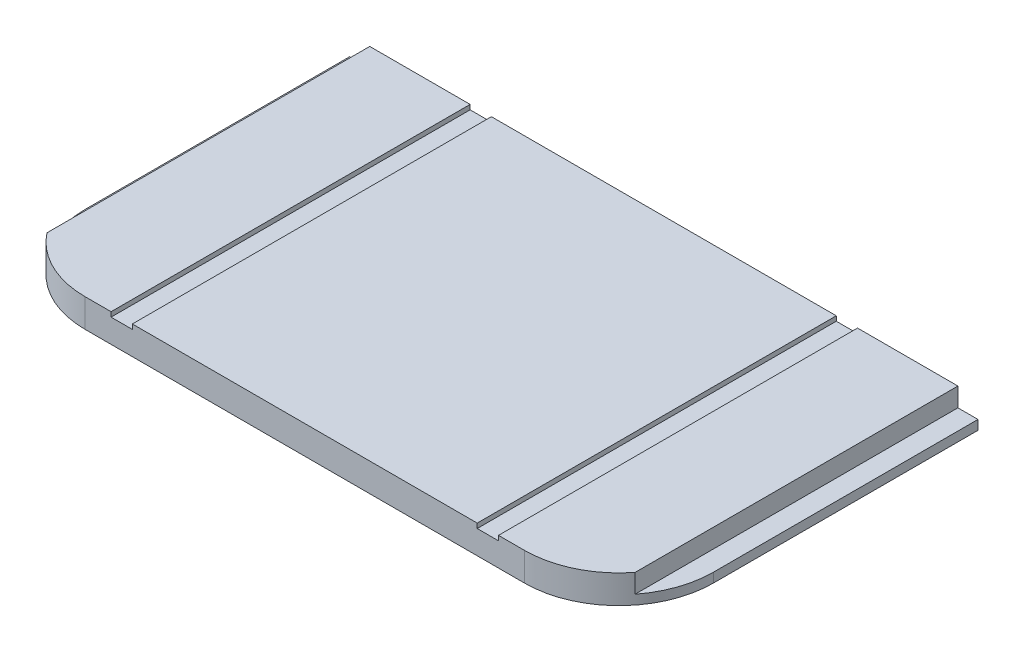
ISO-10303-21;
HEADER;
FILE_DESCRIPTION(('STEP AP214'),'2;1');
FILE_NAME('part.step','',(''),(''),'','','');
FILE_SCHEMA(('AUTOMOTIVE_DESIGN { 1 0 10303 214 1 1 1 1 }'));
ENDSEC;
DATA;
#1=APPLICATION_CONTEXT('core data for automotive mechanical design processes');
#2=APPLICATION_PROTOCOL_DEFINITION('international standard','automotive_design',2000,#1);
#3=PRODUCT_CONTEXT('',#1,'mechanical');
#4=PRODUCT('Part','Part','',(#3));
#5=PRODUCT_RELATED_PRODUCT_CATEGORY('part','',(#4));
#6=PRODUCT_DEFINITION_FORMATION('','',#4);
#7=PRODUCT_DEFINITION_CONTEXT('part definition',#1,'design');
#8=PRODUCT_DEFINITION('design','',#6,#7);
#9=PRODUCT_DEFINITION_SHAPE('','',#8);
#10=(LENGTH_UNIT() NAMED_UNIT(*) SI_UNIT(.MILLI.,.METRE.));
#11=(NAMED_UNIT(*) PLANE_ANGLE_UNIT() SI_UNIT($,.RADIAN.));
#12=(NAMED_UNIT(*) SI_UNIT($,.STERADIAN.) SOLID_ANGLE_UNIT());
#13=UNCERTAINTY_MEASURE_WITH_UNIT(LENGTH_MEASURE(1.E-05),#10,'distance_accuracy_value','');
#14=(GEOMETRIC_REPRESENTATION_CONTEXT(3) GLOBAL_UNCERTAINTY_ASSIGNED_CONTEXT((#13)) GLOBAL_UNIT_ASSIGNED_CONTEXT((#10,
#11,#12)) REPRESENTATION_CONTEXT('',''));
#15=CARTESIAN_POINT('',(0.,0.,0.));
#16=DIRECTION('',(0.,0.,1.));
#17=DIRECTION('',(1.,0.,0.));
#18=AXIS2_PLACEMENT_3D('',#15,#16,#17);
#19=CARTESIAN_POINT('',(211.1375,19.05,-120.65));
#20=DIRECTION('',(0.,-1.,0.));
#21=DIRECTION('',(0.,0.,-1.));
#22=AXIS2_PLACEMENT_3D('',#19,#20,#21);
#23=PLANE('',#22);
#24=DIRECTION('',(1.,0.,0.));
#25=VECTOR('',#24,1.);
#26=CARTESIAN_POINT('',(-211.1375,19.05,120.65));
#27=LINE('',#26,#25);
#28=CARTESIAN_POINT('',(-115.8875,19.05,120.65));
#29=VERTEX_POINT('',#28);
#30=CARTESIAN_POINT('',(115.8875,19.05,120.65));
#31=VERTEX_POINT('',#30);
#32=EDGE_CURVE('E258',#29,#31,#27,.T.);
#33=ORIENTED_EDGE('',*,*,#32,.T.);
#34=DIRECTION('',(0.,0.,1.));
#35=VECTOR('',#34,1.);
#36=CARTESIAN_POINT('',(115.8875,19.05,-120.651));
#37=LINE('',#36,#35);
#38=CARTESIAN_POINT('',(115.8875,19.05,-120.65));
#39=VERTEX_POINT('',#38);
#40=EDGE_CURVE('E209',#39,#31,#37,.T.);
#41=ORIENTED_EDGE('',*,*,#40,.F.);
#42=DIRECTION('',(-1.,0.,0.));
#43=VECTOR('',#42,1.);
#44=CARTESIAN_POINT('',(-211.1375,19.05,-120.65));
#45=LINE('',#44,#43);
#46=CARTESIAN_POINT('',(-115.8875,19.05,-120.65));
#47=VERTEX_POINT('',#46);
#48=EDGE_CURVE('E253',#39,#47,#45,.T.);
#49=ORIENTED_EDGE('',*,*,#48,.T.);
#50=DIRECTION('',(0.,0.,1.));
#51=VECTOR('',#50,1.);
#52=CARTESIAN_POINT('',(-115.8875,19.05,-120.651));
#53=LINE('',#52,#51);
#54=EDGE_CURVE('E238',#47,#29,#53,.T.);
#55=ORIENTED_EDGE('',*,*,#54,.T.);
#56=EDGE_LOOP('',(#33,#41,#49,#55));
#57=FACE_BOUND('',#56,.T.);
#58=ADVANCED_FACE('F33',(#57),#23,.F.);
#59=DIRECTION('',(0.,0.,1.));
#60=VECTOR('',#59,1.);
#61=CARTESIAN_POINT('',(-197.64375,19.05,-120.651));
#62=LINE('',#61,#60);
#63=CARTESIAN_POINT('',(-197.64375,19.05,-120.65));
#64=VERTEX_POINT('',#63);
#65=CARTESIAN_POINT('',(-197.64375,19.05,96.2859803880969));
#66=VERTEX_POINT('',#65);
#67=EDGE_CURVE('E247',#64,#66,#62,.T.);
#68=ORIENTED_EDGE('',*,*,#67,.T.);
#69=CARTESIAN_POINT('',(-147.6375,19.05,57.15));
#70=DIRECTION('',(0.,-1.,0.));
#71=DIRECTION('',(0.,0.,-1.));
#72=AXIS2_PLACEMENT_3D('',#69,#70,#71);
#73=CIRCLE('',#72,63.5);
#74=CARTESIAN_POINT('',(-147.6375,19.05,120.65));
#75=VERTEX_POINT('',#74);
#76=EDGE_CURVE('E11',#66,#75,#73,.F.);
#77=ORIENTED_EDGE('',*,*,#76,.T.);
#78=CARTESIAN_POINT('',(-130.175,19.05,120.65));
#79=VERTEX_POINT('',#78);
#80=EDGE_CURVE('E255',#75,#79,#27,.T.);
#81=ORIENTED_EDGE('',*,*,#80,.T.);
#82=DIRECTION('',(0.,0.,1.));
#83=VECTOR('',#82,1.);
#84=CARTESIAN_POINT('',(-130.175,19.05,-120.651));
#85=LINE('',#84,#83);
#86=CARTESIAN_POINT('',(-130.175,19.05,-120.65));
#87=VERTEX_POINT('',#86);
#88=EDGE_CURVE('E234',#87,#79,#85,.T.);
#89=ORIENTED_EDGE('',*,*,#88,.F.);
#90=EDGE_CURVE('E254',#87,#64,#45,.T.);
#91=ORIENTED_EDGE('',*,*,#90,.T.);
#92=EDGE_LOOP('',(#68,#77,#81,#89,#91));
#93=FACE_BOUND('',#92,.T.);
#94=ADVANCED_FACE('F335',(#93),#23,.F.);
#95=CARTESIAN_POINT('',(211.1375,19.05,120.65));
#96=DIRECTION('',(-1.,0.,0.));
#97=DIRECTION('',(0.,0.,1.));
#98=AXIS2_PLACEMENT_3D('',#95,#96,#97);
#99=PLANE('',#98);
#100=DIRECTION('',(0.,-1.,0.));
#101=VECTOR('',#100,1.);
#102=CARTESIAN_POINT('',(211.1375,19.05,-120.65));
#103=LINE('',#102,#101);
#104=CARTESIAN_POINT('',(211.1375,6.35,-120.65));
#105=VERTEX_POINT('',#104);
#106=CARTESIAN_POINT('',(211.1375,0.,-120.65));
#107=VERTEX_POINT('',#106);
#108=EDGE_CURVE('E271',#105,#107,#103,.T.);
#109=ORIENTED_EDGE('',*,*,#108,.F.);
#110=DIRECTION('',(0.,0.,-1.));
#111=VECTOR('',#110,1.);
#112=CARTESIAN_POINT('',(211.1375,6.35,120.651));
#113=LINE('',#112,#111);
#114=CARTESIAN_POINT('',(211.1375,6.35,57.15));
#115=VERTEX_POINT('',#114);
#116=EDGE_CURVE('E187',#115,#105,#113,.T.);
#117=ORIENTED_EDGE('',*,*,#116,.F.);
#118=DIRECTION('',(0.,-1.,0.));
#119=VECTOR('',#118,1.);
#120=CARTESIAN_POINT('',(211.1375,19.05,57.15));
#121=LINE('',#120,#119);
#122=CARTESIAN_POINT('',(211.1375,0.,57.15));
#123=VERTEX_POINT('',#122);
#124=EDGE_CURVE('E273',#115,#123,#121,.T.);
#125=ORIENTED_EDGE('',*,*,#124,.T.);
#126=DIRECTION('',(0.,0.,-1.));
#127=VECTOR('',#126,1.);
#128=CARTESIAN_POINT('',(211.1375,0.,120.65));
#129=LINE('',#128,#127);
#130=EDGE_CURVE('E249',#123,#107,#129,.T.);
#131=ORIENTED_EDGE('',*,*,#130,.T.);
#132=EDGE_LOOP('',(#109,#117,#125,#131));
#133=FACE_BOUND('',#132,.T.);
#134=ADVANCED_FACE('F341',(#133),#99,.F.);
#135=CARTESIAN_POINT('',(-211.1375,19.05,-120.65));
#136=DIRECTION('',(0.,0.,1.));
#137=DIRECTION('',(1.,0.,0.));
#138=AXIS2_PLACEMENT_3D('',#135,#136,#137);
#139=PLANE('',#138);
#140=DIRECTION('',(-1.,0.,0.));
#141=VECTOR('',#140,1.);
#142=CARTESIAN_POINT('',(-197.64375,6.35,-120.65));
#143=LINE('',#142,#141);
#144=CARTESIAN_POINT('',(-197.64375,6.35,-120.65));
#145=VERTEX_POINT('',#144);
#146=CARTESIAN_POINT('',(-211.1375,6.35,-120.65));
#147=VERTEX_POINT('',#146);
#148=EDGE_CURVE('E177',#145,#147,#143,.T.);
#149=ORIENTED_EDGE('',*,*,#148,.F.);
#150=DIRECTION('',(0.,-1.,0.));
#151=VECTOR('',#150,1.);
#152=CARTESIAN_POINT('',(-197.64375,19.05,-120.65));
#153=LINE('',#152,#151);
#154=EDGE_CURVE('E176',#64,#145,#153,.T.);
#155=ORIENTED_EDGE('',*,*,#154,.F.);
#156=ORIENTED_EDGE('',*,*,#90,.F.);
#157=DIRECTION('',(0.,1.,0.));
#158=VECTOR('',#157,1.);
#159=CARTESIAN_POINT('',(-130.175,19.05,-120.65));
#160=LINE('',#159,#158);
#161=CARTESIAN_POINT('',(-130.175,15.875,-120.65));
#162=VERTEX_POINT('',#161);
#163=EDGE_CURVE('E223',#162,#87,#160,.T.);
#164=ORIENTED_EDGE('',*,*,#163,.F.);
#165=DIRECTION('',(-1.,0.,0.));
#166=VECTOR('',#165,1.);
#167=CARTESIAN_POINT('',(-130.175,15.875,-120.65));
#168=LINE('',#167,#166);
#169=CARTESIAN_POINT('',(-115.8875,15.875,-120.65));
#170=VERTEX_POINT('',#169);
#171=EDGE_CURVE('E237',#170,#162,#168,.T.);
#172=ORIENTED_EDGE('',*,*,#171,.F.);
#173=DIRECTION('',(0.,-1.,0.));
#174=VECTOR('',#173,1.);
#175=CARTESIAN_POINT('',(-115.8875,19.05,-120.65));
#176=LINE('',#175,#174);
#177=EDGE_CURVE('E220',#47,#170,#176,.T.);
#178=ORIENTED_EDGE('',*,*,#177,.F.);
#179=ORIENTED_EDGE('',*,*,#48,.F.);
#180=DIRECTION('',(0.,1.,0.));
#181=VECTOR('',#180,1.);
#182=CARTESIAN_POINT('',(115.8875,19.05,-120.65));
#183=LINE('',#182,#181);
#184=CARTESIAN_POINT('',(115.8875,15.875,-120.65));
#185=VERTEX_POINT('',#184);
#186=EDGE_CURVE('E198',#185,#39,#183,.T.);
#187=ORIENTED_EDGE('',*,*,#186,.F.);
#188=DIRECTION('',(-1.,0.,0.));
#189=VECTOR('',#188,1.);
#190=CARTESIAN_POINT('',(115.8875,15.875,-120.65));
#191=LINE('',#190,#189);
#192=CARTESIAN_POINT('',(130.175,15.875,-120.65));
#193=VERTEX_POINT('',#192);
#194=EDGE_CURVE('E211',#193,#185,#191,.T.);
#195=ORIENTED_EDGE('',*,*,#194,.F.);
#196=DIRECTION('',(0.,-1.,0.));
#197=VECTOR('',#196,1.);
#198=CARTESIAN_POINT('',(130.175,19.05,-120.65));
#199=LINE('',#198,#197);
#200=CARTESIAN_POINT('',(130.175,19.05,-120.65));
#201=VERTEX_POINT('',#200);
#202=EDGE_CURVE('E195',#201,#193,#199,.T.);
#203=ORIENTED_EDGE('',*,*,#202,.F.);
#204=CARTESIAN_POINT('',(197.64375,19.05,-120.65));
#205=VERTEX_POINT('',#204);
#206=EDGE_CURVE('E250',#205,#201,#45,.T.);
#207=ORIENTED_EDGE('',*,*,#206,.F.);
#208=DIRECTION('',(0.,1.,0.));
#209=VECTOR('',#208,1.);
#210=CARTESIAN_POINT('',(197.64375,19.05,-120.65));
#211=LINE('',#210,#209);
#212=CARTESIAN_POINT('',(197.64375,6.35,-120.65));
#213=VERTEX_POINT('',#212);
#214=EDGE_CURVE('E190',#213,#205,#211,.T.);
#215=ORIENTED_EDGE('',*,*,#214,.F.);
#216=DIRECTION('',(-1.,0.,0.));
#217=VECTOR('',#216,1.);
#218=CARTESIAN_POINT('',(197.64375,6.35,-120.65));
#219=LINE('',#218,#217);
#220=EDGE_CURVE('E184',#105,#213,#219,.T.);
#221=ORIENTED_EDGE('',*,*,#220,.F.);
#222=ORIENTED_EDGE('',*,*,#108,.T.);
#223=DIRECTION('',(-1.,0.,0.));
#224=VECTOR('',#223,1.);
#225=CARTESIAN_POINT('',(-211.1375,0.,-120.65));
#226=LINE('',#225,#224);
#227=CARTESIAN_POINT('',(-211.1375,0.,-120.65));
#228=VERTEX_POINT('',#227);
#229=EDGE_CURVE('E261',#107,#228,#226,.T.);
#230=ORIENTED_EDGE('',*,*,#229,.T.);
#231=DIRECTION('',(0.,-1.,0.));
#232=VECTOR('',#231,1.);
#233=CARTESIAN_POINT('',(-211.1375,19.05,-120.65));
#234=LINE('',#233,#232);
#235=EDGE_CURVE('E257',#147,#228,#234,.T.);
#236=ORIENTED_EDGE('',*,*,#235,.F.);
#237=EDGE_LOOP('',(#149,#155,#156,#164,#172,#178,#179,#187,#195,#203,#207,#215,#221,#222,#230,#236));
#238=FACE_BOUND('',#237,.T.);
#239=ADVANCED_FACE('F328',(#238),#139,.F.);
#240=CARTESIAN_POINT('',(-211.1375,19.05,120.65));
#241=DIRECTION('',(1.,0.,0.));
#242=DIRECTION('',(0.,0.,-1.));
#243=AXIS2_PLACEMENT_3D('',#240,#241,#242);
#244=PLANE('',#243);
#245=DIRECTION('',(0.,-1.,0.));
#246=VECTOR('',#245,1.);
#247=CARTESIAN_POINT('',(-211.1375,19.05,57.15));
#248=LINE('',#247,#246);
#249=CARTESIAN_POINT('',(-211.1375,0.,57.15));
#250=VERTEX_POINT('',#249);
#251=CARTESIAN_POINT('',(-211.1375,6.35,57.15));
#252=VERTEX_POINT('',#251);
#253=EDGE_CURVE('E167',#250,#252,#248,.F.);
#254=ORIENTED_EDGE('',*,*,#253,.T.);
#255=DIRECTION('',(0.,0.,-1.));
#256=VECTOR('',#255,1.);
#257=CARTESIAN_POINT('',(-211.1375,6.35,120.651));
#258=LINE('',#257,#256);
#259=EDGE_CURVE('E48',#252,#147,#258,.T.);
#260=ORIENTED_EDGE('',*,*,#259,.T.);
#261=ORIENTED_EDGE('',*,*,#235,.T.);
#262=DIRECTION('',(0.,0.,1.));
#263=VECTOR('',#262,1.);
#264=CARTESIAN_POINT('',(-211.1375,0.,120.65));
#265=LINE('',#264,#263);
#266=EDGE_CURVE('E264',#228,#250,#265,.T.);
#267=ORIENTED_EDGE('',*,*,#266,.T.);
#268=EDGE_LOOP('',(#254,#260,#261,#267));
#269=FACE_BOUND('',#268,.T.);
#270=ADVANCED_FACE('F288',(#269),#244,.F.);
#271=CARTESIAN_POINT('',(-211.1375,19.05,120.65));
#272=DIRECTION('',(0.,0.,-1.));
#273=DIRECTION('',(-1.,0.,0.));
#274=AXIS2_PLACEMENT_3D('',#271,#272,#273);
#275=PLANE('',#274);
#276=DIRECTION('',(1.,0.,0.));
#277=VECTOR('',#276,1.);
#278=CARTESIAN_POINT('',(-211.1375,0.,120.65));
#279=LINE('',#278,#277);
#280=CARTESIAN_POINT('',(-147.6375,0.,120.65));
#281=VERTEX_POINT('',#280);
#282=CARTESIAN_POINT('',(147.6375,0.,120.65));
#283=VERTEX_POINT('',#282);
#284=EDGE_CURVE('E267',#281,#283,#279,.T.);
#285=ORIENTED_EDGE('',*,*,#284,.T.);
#286=DIRECTION('',(0.,-1.,0.));
#287=VECTOR('',#286,1.);
#288=CARTESIAN_POINT('',(147.6375,19.05,120.65));
#289=LINE('',#288,#287);
#290=CARTESIAN_POINT('',(147.6375,19.05,120.65));
#291=VERTEX_POINT('',#290);
#292=EDGE_CURVE('E282',#283,#291,#289,.F.);
#293=ORIENTED_EDGE('',*,*,#292,.T.);
#294=CARTESIAN_POINT('',(130.175,19.05,120.65));
#295=VERTEX_POINT('',#294);
#296=EDGE_CURVE('E252',#295,#291,#27,.T.);
#297=ORIENTED_EDGE('',*,*,#296,.F.);
#298=DIRECTION('',(0.,1.,0.));
#299=VECTOR('',#298,1.);
#300=CARTESIAN_POINT('',(130.175,19.05,120.65));
#301=LINE('',#300,#299);
#302=CARTESIAN_POINT('',(130.175,15.875,120.65));
#303=VERTEX_POINT('',#302);
#304=EDGE_CURVE('E206',#303,#295,#301,.T.);
#305=ORIENTED_EDGE('',*,*,#304,.F.);
#306=DIRECTION('',(1.,0.,0.));
#307=VECTOR('',#306,1.);
#308=CARTESIAN_POINT('',(115.8875,15.875,120.65));
#309=LINE('',#308,#307);
#310=CARTESIAN_POINT('',(115.8875,15.875,120.65));
#311=VERTEX_POINT('',#310);
#312=EDGE_CURVE('E203',#311,#303,#309,.T.);
#313=ORIENTED_EDGE('',*,*,#312,.F.);
#314=DIRECTION('',(0.,-1.,0.));
#315=VECTOR('',#314,1.);
#316=CARTESIAN_POINT('',(115.8875,19.05,120.65));
#317=LINE('',#316,#315);
#318=EDGE_CURVE('E200',#31,#311,#317,.T.);
#319=ORIENTED_EDGE('',*,*,#318,.F.);
#320=ORIENTED_EDGE('',*,*,#32,.F.);
#321=DIRECTION('',(0.,1.,0.));
#322=VECTOR('',#321,1.);
#323=CARTESIAN_POINT('',(-115.8875,19.05,120.65));
#324=LINE('',#323,#322);
#325=CARTESIAN_POINT('',(-115.8875,15.875,120.65));
#326=VERTEX_POINT('',#325);
#327=EDGE_CURVE('E231',#326,#29,#324,.T.);
#328=ORIENTED_EDGE('',*,*,#327,.F.);
#329=DIRECTION('',(1.,0.,0.));
#330=VECTOR('',#329,1.);
#331=CARTESIAN_POINT('',(-130.175,15.875,120.65));
#332=LINE('',#331,#330);
#333=CARTESIAN_POINT('',(-130.175,15.875,120.65));
#334=VERTEX_POINT('',#333);
#335=EDGE_CURVE('E228',#334,#326,#332,.T.);
#336=ORIENTED_EDGE('',*,*,#335,.F.);
#337=DIRECTION('',(0.,-1.,0.));
#338=VECTOR('',#337,1.);
#339=CARTESIAN_POINT('',(-130.175,19.05,120.65));
#340=LINE('',#339,#338);
#341=EDGE_CURVE('E225',#79,#334,#340,.T.);
#342=ORIENTED_EDGE('',*,*,#341,.F.);
#343=ORIENTED_EDGE('',*,*,#80,.F.);
#344=DIRECTION('',(0.,-1.,0.));
#345=VECTOR('',#344,1.);
#346=CARTESIAN_POINT('',(-147.6375,19.05,120.65));
#347=LINE('',#346,#345);
#348=EDGE_CURVE('E279',#75,#281,#347,.T.);
#349=ORIENTED_EDGE('',*,*,#348,.T.);
#350=EDGE_LOOP('',(#285,#293,#297,#305,#313,#319,#320,#328,#336,#342,#343,#349));
#351=FACE_BOUND('',#350,.T.);
#352=ADVANCED_FACE('F295',(#351),#275,.F.);
#353=ORIENTED_EDGE('',*,*,#296,.T.);
#354=CARTESIAN_POINT('',(147.6375,19.05,57.15));
#355=DIRECTION('',(0.,-1.,0.));
#356=DIRECTION('',(0.,0.,-1.));
#357=AXIS2_PLACEMENT_3D('',#354,#355,#356);
#358=CIRCLE('',#357,63.5);
#359=CARTESIAN_POINT('',(197.64375,19.05,96.2859803880969));
#360=VERTEX_POINT('',#359);
#361=EDGE_CURVE('E284',#291,#360,#358,.F.);
#362=ORIENTED_EDGE('',*,*,#361,.T.);
#363=DIRECTION('',(0.,0.,1.));
#364=VECTOR('',#363,1.);
#365=CARTESIAN_POINT('',(197.64375,19.05,-120.651));
#366=LINE('',#365,#364);
#367=EDGE_CURVE('E193',#205,#360,#366,.T.);
#368=ORIENTED_EDGE('',*,*,#367,.F.);
#369=ORIENTED_EDGE('',*,*,#206,.T.);
#370=DIRECTION('',(0.,0.,1.));
#371=VECTOR('',#370,1.);
#372=CARTESIAN_POINT('',(130.175,19.05,-120.651));
#373=LINE('',#372,#371);
#374=EDGE_CURVE('E212',#201,#295,#373,.T.);
#375=ORIENTED_EDGE('',*,*,#374,.T.);
#376=EDGE_LOOP('',(#353,#362,#368,#369,#375));
#377=FACE_BOUND('',#376,.T.);
#378=ADVANCED_FACE('F310',(#377),#23,.F.);
#379=CARTESIAN_POINT('',(211.1375,0.,-120.65));
#380=DIRECTION('',(0.,-1.,0.));
#381=DIRECTION('',(0.,0.,-1.));
#382=AXIS2_PLACEMENT_3D('',#379,#380,#381);
#383=PLANE('',#382);
#384=ORIENTED_EDGE('',*,*,#130,.F.);
#385=CARTESIAN_POINT('',(147.6375,0.,57.15));
#386=DIRECTION('',(0.,-1.,0.));
#387=DIRECTION('',(0.,0.,-1.));
#388=AXIS2_PLACEMENT_3D('',#385,#386,#387);
#389=CIRCLE('',#388,63.5);
#390=EDGE_CURVE('E277',#123,#283,#389,.T.);
#391=ORIENTED_EDGE('',*,*,#390,.T.);
#392=ORIENTED_EDGE('',*,*,#284,.F.);
#393=CARTESIAN_POINT('',(-147.6375,0.,57.15));
#394=DIRECTION('',(0.,-1.,0.));
#395=DIRECTION('',(0.,0.,-1.));
#396=AXIS2_PLACEMENT_3D('',#393,#394,#395);
#397=CIRCLE('',#396,63.5);
#398=EDGE_CURVE('E275',#281,#250,#397,.T.);
#399=ORIENTED_EDGE('',*,*,#398,.T.);
#400=ORIENTED_EDGE('',*,*,#266,.F.);
#401=ORIENTED_EDGE('',*,*,#229,.F.);
#402=EDGE_LOOP('',(#384,#391,#392,#399,#400,#401));
#403=FACE_BOUND('',#402,.T.);
#404=ADVANCED_FACE('F299',(#403),#383,.T.);
#405=CARTESIAN_POINT('',(-197.64375,19.05,-120.651));
#406=DIRECTION('',(1.,0.,0.));
#407=DIRECTION('',(0.,0.,-1.));
#408=AXIS2_PLACEMENT_3D('',#405,#406,#407);
#409=PLANE('',#408);
#410=ORIENTED_EDGE('',*,*,#154,.T.);
#411=DIRECTION('',(0.,0.,-1.));
#412=VECTOR('',#411,1.);
#413=CARTESIAN_POINT('',(-197.64375,6.35,120.651));
#414=LINE('',#413,#412);
#415=CARTESIAN_POINT('',(-197.64375,6.35,96.2859803880969));
#416=VERTEX_POINT('',#415);
#417=EDGE_CURVE('E170',#416,#145,#414,.T.);
#418=ORIENTED_EDGE('',*,*,#417,.F.);
#419=DIRECTION('',(0.,-1.,0.));
#420=VECTOR('',#419,1.);
#421=CARTESIAN_POINT('',(-197.64375,15.875,96.2859803880969));
#422=LINE('',#421,#420);
#423=EDGE_CURVE('E41',#416,#66,#422,.F.);
#424=ORIENTED_EDGE('',*,*,#423,.T.);
#425=ORIENTED_EDGE('',*,*,#67,.F.);
#426=EDGE_LOOP('',(#410,#418,#424,#425));
#427=FACE_BOUND('',#426,.T.);
#428=ADVANCED_FACE('F174',(#427),#409,.F.);
#429=CARTESIAN_POINT('',(-130.175,19.05,-120.651));
#430=DIRECTION('',(-1.,0.,0.));
#431=DIRECTION('',(0.,0.,1.));
#432=AXIS2_PLACEMENT_3D('',#429,#430,#431);
#433=PLANE('',#432);
#434=ORIENTED_EDGE('',*,*,#163,.T.);
#435=ORIENTED_EDGE('',*,*,#88,.T.);
#436=ORIENTED_EDGE('',*,*,#341,.T.);
#437=DIRECTION('',(0.,0.,1.));
#438=VECTOR('',#437,1.);
#439=CARTESIAN_POINT('',(-130.175,15.875,-120.651));
#440=LINE('',#439,#438);
#441=EDGE_CURVE('E233',#162,#334,#440,.T.);
#442=ORIENTED_EDGE('',*,*,#441,.F.);
#443=EDGE_LOOP('',(#434,#435,#436,#442));
#444=FACE_BOUND('',#443,.T.);
#445=ADVANCED_FACE('F422',(#444),#433,.F.);
#446=CARTESIAN_POINT('',(-115.8875,19.05,-120.651));
#447=DIRECTION('',(1.,0.,0.));
#448=DIRECTION('',(0.,0.,-1.));
#449=AXIS2_PLACEMENT_3D('',#446,#447,#448);
#450=PLANE('',#449);
#451=ORIENTED_EDGE('',*,*,#177,.T.);
#452=DIRECTION('',(0.,0.,1.));
#453=VECTOR('',#452,1.);
#454=CARTESIAN_POINT('',(-115.8875,15.875,-120.651));
#455=LINE('',#454,#453);
#456=EDGE_CURVE('E241',#170,#326,#455,.T.);
#457=ORIENTED_EDGE('',*,*,#456,.T.);
#458=ORIENTED_EDGE('',*,*,#327,.T.);
#459=ORIENTED_EDGE('',*,*,#54,.F.);
#460=EDGE_LOOP('',(#451,#457,#458,#459));
#461=FACE_BOUND('',#460,.T.);
#462=ADVANCED_FACE('F463',(#461),#450,.F.);
#463=CARTESIAN_POINT('',(-130.175,15.875,-120.651));
#464=DIRECTION('',(0.,-1.,0.));
#465=DIRECTION('',(1.,0.,0.));
#466=AXIS2_PLACEMENT_3D('',#463,#464,#465);
#467=PLANE('',#466);
#468=ORIENTED_EDGE('',*,*,#171,.T.);
#469=ORIENTED_EDGE('',*,*,#441,.T.);
#470=ORIENTED_EDGE('',*,*,#335,.T.);
#471=ORIENTED_EDGE('',*,*,#456,.F.);
#472=EDGE_LOOP('',(#468,#469,#470,#471));
#473=FACE_BOUND('',#472,.T.);
#474=ADVANCED_FACE('F472',(#473),#467,.F.);
#475=CARTESIAN_POINT('',(115.8875,19.05,-120.651));
#476=DIRECTION('',(-1.,0.,0.));
#477=DIRECTION('',(0.,0.,1.));
#478=AXIS2_PLACEMENT_3D('',#475,#476,#477);
#479=PLANE('',#478);
#480=ORIENTED_EDGE('',*,*,#186,.T.);
#481=ORIENTED_EDGE('',*,*,#40,.T.);
#482=ORIENTED_EDGE('',*,*,#318,.T.);
#483=DIRECTION('',(0.,0.,1.));
#484=VECTOR('',#483,1.);
#485=CARTESIAN_POINT('',(115.8875,15.875,-120.651));
#486=LINE('',#485,#484);
#487=EDGE_CURVE('E208',#185,#311,#486,.T.);
#488=ORIENTED_EDGE('',*,*,#487,.F.);
#489=EDGE_LOOP('',(#480,#481,#482,#488));
#490=FACE_BOUND('',#489,.T.);
#491=ADVANCED_FACE('F324',(#490),#479,.F.);
#492=CARTESIAN_POINT('',(130.175,19.05,-120.651));
#493=DIRECTION('',(1.,0.,0.));
#494=DIRECTION('',(0.,0.,-1.));
#495=AXIS2_PLACEMENT_3D('',#492,#493,#494);
#496=PLANE('',#495);
#497=ORIENTED_EDGE('',*,*,#202,.T.);
#498=DIRECTION('',(0.,0.,1.));
#499=VECTOR('',#498,1.);
#500=CARTESIAN_POINT('',(130.175,15.875,-120.651));
#501=LINE('',#500,#499);
#502=EDGE_CURVE('E215',#193,#303,#501,.T.);
#503=ORIENTED_EDGE('',*,*,#502,.T.);
#504=ORIENTED_EDGE('',*,*,#304,.T.);
#505=ORIENTED_EDGE('',*,*,#374,.F.);
#506=EDGE_LOOP('',(#497,#503,#504,#505));
#507=FACE_BOUND('',#506,.T.);
#508=ADVANCED_FACE('F347',(#507),#496,.F.);
#509=CARTESIAN_POINT('',(115.8875,15.875,-120.651));
#510=DIRECTION('',(0.,-1.,0.));
#511=DIRECTION('',(1.,0.,0.));
#512=AXIS2_PLACEMENT_3D('',#509,#510,#511);
#513=PLANE('',#512);
#514=ORIENTED_EDGE('',*,*,#194,.T.);
#515=ORIENTED_EDGE('',*,*,#487,.T.);
#516=ORIENTED_EDGE('',*,*,#312,.T.);
#517=ORIENTED_EDGE('',*,*,#502,.F.);
#518=EDGE_LOOP('',(#514,#515,#516,#517));
#519=FACE_BOUND('',#518,.T.);
#520=ADVANCED_FACE('F349',(#519),#513,.F.);
#521=CARTESIAN_POINT('',(197.64375,19.05,-120.651));
#522=DIRECTION('',(-1.,0.,0.));
#523=DIRECTION('',(0.,0.,1.));
#524=AXIS2_PLACEMENT_3D('',#521,#522,#523);
#525=PLANE('',#524);
#526=ORIENTED_EDGE('',*,*,#367,.T.);
#527=DIRECTION('',(0.,-1.,0.));
#528=VECTOR('',#527,1.);
#529=CARTESIAN_POINT('',(197.64375,19.05,96.2859803880969));
#530=LINE('',#529,#528);
#531=CARTESIAN_POINT('',(197.64375,6.35,96.2859803880969));
#532=VERTEX_POINT('',#531);
#533=EDGE_CURVE('E56',#360,#532,#530,.T.);
#534=ORIENTED_EDGE('',*,*,#533,.T.);
#535=DIRECTION('',(0.,0.,-1.));
#536=VECTOR('',#535,1.);
#537=CARTESIAN_POINT('',(197.64375,6.35,120.651));
#538=LINE('',#537,#536);
#539=EDGE_CURVE('E188',#532,#213,#538,.T.);
#540=ORIENTED_EDGE('',*,*,#539,.T.);
#541=ORIENTED_EDGE('',*,*,#214,.T.);
#542=EDGE_LOOP('',(#526,#534,#540,#541));
#543=FACE_BOUND('',#542,.T.);
#544=ADVANCED_FACE('F344',(#543),#525,.F.);
#545=CARTESIAN_POINT('',(147.6375,19.05,57.15));
#546=DIRECTION('',(0.,-1.,0.));
#547=DIRECTION('',(0.,0.,-1.));
#548=AXIS2_PLACEMENT_3D('',#545,#546,#547);
#549=CYLINDRICAL_SURFACE('',#548,63.5);
#550=CARTESIAN_POINT('',(147.6375,6.35000000000001,57.15));
#551=DIRECTION('',(0.,-1.,0.));
#552=DIRECTION('',(1.,0.,0.));
#553=AXIS2_PLACEMENT_3D('',#550,#551,#552);
#554=CIRCLE('',#553,63.5);
#555=EDGE_CURVE('E172',#115,#532,#554,.T.);
#556=ORIENTED_EDGE('',*,*,#555,.T.);
#557=ORIENTED_EDGE('',*,*,#533,.F.);
#558=ORIENTED_EDGE('',*,*,#361,.F.);
#559=ORIENTED_EDGE('',*,*,#292,.F.);
#560=ORIENTED_EDGE('',*,*,#390,.F.);
#561=ORIENTED_EDGE('',*,*,#124,.F.);
#562=EDGE_LOOP('',(#556,#557,#558,#559,#560,#561));
#563=FACE_BOUND('',#562,.T.);
#564=ADVANCED_FACE('F304',(#563),#549,.T.);
#565=CARTESIAN_POINT('',(-147.6375,19.05,57.15));
#566=DIRECTION('',(0.,-1.,0.));
#567=DIRECTION('',(0.,0.,-1.));
#568=AXIS2_PLACEMENT_3D('',#565,#566,#567);
#569=CYLINDRICAL_SURFACE('',#568,63.5);
#570=ORIENTED_EDGE('',*,*,#423,.F.);
#571=CARTESIAN_POINT('',(-147.6375,6.35,57.15));
#572=DIRECTION('',(0.,-1.,0.));
#573=DIRECTION('',(0.,0.,-1.));
#574=AXIS2_PLACEMENT_3D('',#571,#572,#573);
#575=CIRCLE('',#574,63.5);
#576=EDGE_CURVE('E160',#416,#252,#575,.T.);
#577=ORIENTED_EDGE('',*,*,#576,.T.);
#578=ORIENTED_EDGE('',*,*,#253,.F.);
#579=ORIENTED_EDGE('',*,*,#398,.F.);
#580=ORIENTED_EDGE('',*,*,#348,.F.);
#581=ORIENTED_EDGE('',*,*,#76,.F.);
#582=EDGE_LOOP('',(#570,#577,#578,#579,#580,#581));
#583=FACE_BOUND('',#582,.T.);
#584=ADVANCED_FACE('F35',(#583),#569,.T.);
#585=CARTESIAN_POINT('',(197.64375,6.35,120.651));
#586=DIRECTION('',(0.,-1.,0.));
#587=DIRECTION('',(1.,0.,0.));
#588=AXIS2_PLACEMENT_3D('',#585,#586,#587);
#589=PLANE('',#588);
#590=ORIENTED_EDGE('',*,*,#116,.T.);
#591=ORIENTED_EDGE('',*,*,#220,.T.);
#592=ORIENTED_EDGE('',*,*,#539,.F.);
#593=ORIENTED_EDGE('',*,*,#555,.F.);
#594=EDGE_LOOP('',(#590,#591,#592,#593));
#595=FACE_BOUND('',#594,.T.);
#596=ADVANCED_FACE('F343',(#595),#589,.F.);
#597=CARTESIAN_POINT('',(-197.64375,6.35,120.651));
#598=DIRECTION('',(0.,-1.,0.));
#599=DIRECTION('',(0.,0.,-1.));
#600=AXIS2_PLACEMENT_3D('',#597,#598,#599);
#601=PLANE('',#600);
#602=ORIENTED_EDGE('',*,*,#417,.T.);
#603=ORIENTED_EDGE('',*,*,#148,.T.);
#604=ORIENTED_EDGE('',*,*,#259,.F.);
#605=ORIENTED_EDGE('',*,*,#576,.F.);
#606=EDGE_LOOP('',(#602,#603,#604,#605));
#607=FACE_BOUND('',#606,.T.);
#608=ADVANCED_FACE('F169',(#607),#601,.F.);
#609=CLOSED_SHELL('',(#58,#94,#134,#239,#270,#352,#378,#404,#428,#445,#462,#474,#491,#508,#520,
#544,#564,#584,#596,#608));
#610=MANIFOLD_SOLID_BREP('B2',#609);
#611=ADVANCED_BREP_SHAPE_REPRESENTATION('',(#18,#610),#14);
#612=SHAPE_DEFINITION_REPRESENTATION(#9,#611);
ENDSEC;
END-ISO-10303-21;
